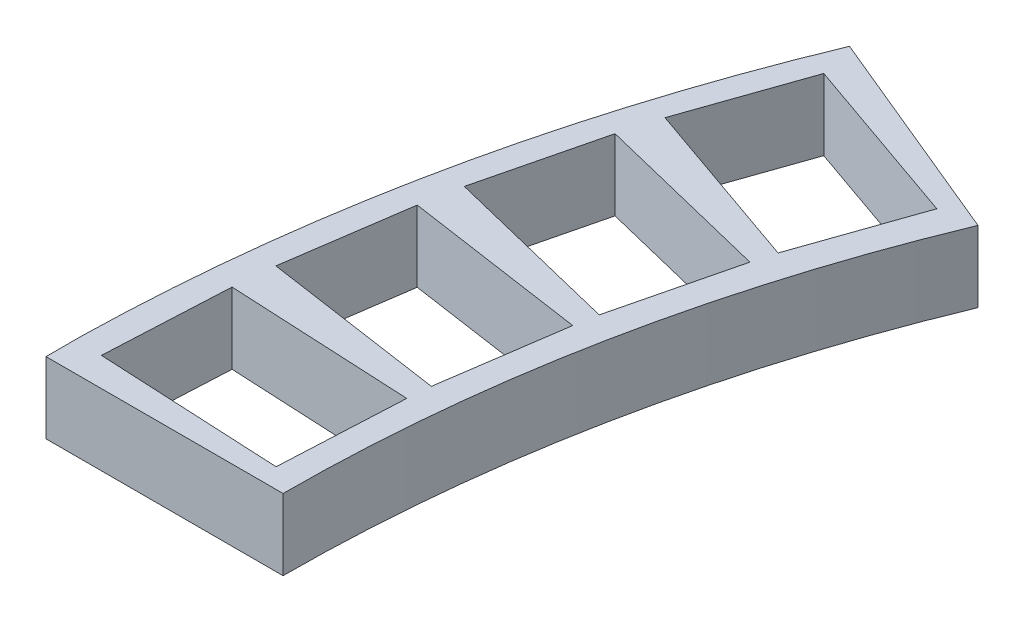
ISO-10303-21;
HEADER;
FILE_DESCRIPTION(('STEP AP214'),'2;1');
FILE_NAME('part.step','',(''),(''),'','','');
FILE_SCHEMA(('AUTOMOTIVE_DESIGN { 1 0 10303 214 1 1 1 1 }'));
ENDSEC;
DATA;
#1=APPLICATION_CONTEXT('core data for automotive mechanical design processes');
#2=APPLICATION_PROTOCOL_DEFINITION('international standard','automotive_design',2000,#1);
#3=PRODUCT_CONTEXT('',#1,'mechanical');
#4=PRODUCT('Part','Part','',(#3));
#5=PRODUCT_RELATED_PRODUCT_CATEGORY('part','',(#4));
#6=PRODUCT_DEFINITION_FORMATION('','',#4);
#7=PRODUCT_DEFINITION_CONTEXT('part definition',#1,'design');
#8=PRODUCT_DEFINITION('design','',#6,#7);
#9=PRODUCT_DEFINITION_SHAPE('','',#8);
#10=(LENGTH_UNIT() NAMED_UNIT(*) SI_UNIT(.MILLI.,.METRE.));
#11=(NAMED_UNIT(*) PLANE_ANGLE_UNIT() SI_UNIT($,.RADIAN.));
#12=(NAMED_UNIT(*) SI_UNIT($,.STERADIAN.) SOLID_ANGLE_UNIT());
#13=UNCERTAINTY_MEASURE_WITH_UNIT(LENGTH_MEASURE(1.E-05),#10,'distance_accuracy_value','');
#14=(GEOMETRIC_REPRESENTATION_CONTEXT(3) GLOBAL_UNCERTAINTY_ASSIGNED_CONTEXT((#13)) GLOBAL_UNIT_ASSIGNED_CONTEXT((#10,
#11,#12)) REPRESENTATION_CONTEXT('',''));
#15=CARTESIAN_POINT('',(0.,0.,0.));
#16=DIRECTION('',(0.,0.,1.));
#17=DIRECTION('',(1.,0.,0.));
#18=AXIS2_PLACEMENT_3D('',#15,#16,#17);
#19=CARTESIAN_POINT('',(0.,12.,0.));
#20=DIRECTION('',(0.,-1.,0.));
#21=DIRECTION('',(0.,0.,-1.));
#22=AXIS2_PLACEMENT_3D('',#19,#20,#21);
#23=PLANE('',#22);
#24=DIRECTION('',(0.998775470850136,0.,0.0494728089771555));
#25=VECTOR('',#24,1.);
#26=CARTESIAN_POINT('',(-259.677683337546,12.,-3.31462064663184));
#27=LINE('',#26,#25);
#28=CARTESIAN_POINT('',(-290.6397229339,12.,-4.84827772492366));
#29=VERTEX_POINT('',#28);
#30=CARTESIAN_POINT('',(-259.677683337546,12.,-3.31462064663184));
#31=VERTEX_POINT('',#30);
#32=EDGE_CURVE('E215',#29,#31,#27,.T.);
#33=ORIENTED_EDGE('',*,*,#32,.F.);
#34=DIRECTION('',(-0.0494728089771553,0.,0.998775470850135));
#35=VECTOR('',#34,1.);
#36=CARTESIAN_POINT('',(-290.6397229339,12.,-4.84827772492366));
#37=LINE('',#36,#35);
#38=CARTESIAN_POINT('',(-289.60079394538,12.,-25.8225626127765));
#39=VERTEX_POINT('',#38);
#40=EDGE_CURVE('E223',#39,#29,#37,.T.);
#41=ORIENTED_EDGE('',*,*,#40,.F.);
#42=DIRECTION('',(-0.998775470850136,0.,-0.0494728089771557));
#43=VECTOR('',#42,1.);
#44=CARTESIAN_POINT('',(-289.60079394538,12.,-25.8225626127765));
#45=LINE('',#44,#43);
#46=CARTESIAN_POINT('',(-258.638754349026,12.,-24.2889055344847));
#47=VERTEX_POINT('',#46);
#48=EDGE_CURVE('E220',#47,#39,#45,.T.);
#49=ORIENTED_EDGE('',*,*,#48,.F.);
#50=DIRECTION('',(0.0494728089771553,0.,-0.998775470850135));
#51=VECTOR('',#50,1.);
#52=CARTESIAN_POINT('',(-258.638754349026,12.,-24.2889055344847));
#53=LINE('',#52,#51);
#54=EDGE_CURVE('E217',#31,#47,#53,.T.);
#55=ORIENTED_EDGE('',*,*,#54,.F.);
#56=EDGE_LOOP('',(#33,#41,#49,#55));
#57=FACE_BOUND('',#56,.T.);
#58=DIRECTION('',(0.97123518890275,0.,0.238122253972701));
#59=VECTOR('',#58,1.);
#60=CARTESIAN_POINT('',(-254.615566778779,12.,-52.6883531890566));
#61=LINE('',#60,#59);
#62=CARTESIAN_POINT('',(-284.723857634765,12.,-60.0701430622103));
#63=VERTEX_POINT('',#62);
#64=CARTESIAN_POINT('',(-254.615566778779,12.,-52.6883531890566));
#65=VERTEX_POINT('',#64);
#66=EDGE_CURVE('E277',#63,#65,#61,.T.);
#67=ORIENTED_EDGE('',*,*,#66,.F.);
#68=DIRECTION('',(-0.238122253972697,0.,0.971235188902751));
#69=VECTOR('',#68,1.);
#70=CARTESIAN_POINT('',(-284.723857634765,12.,-60.0701430622103));
#71=LINE('',#70,#69);
#72=CARTESIAN_POINT('',(-279.723290301338,12.,-80.4660820291681));
#73=VERTEX_POINT('',#72);
#74=EDGE_CURVE('E285',#73,#63,#71,.T.);
#75=ORIENTED_EDGE('',*,*,#74,.F.);
#76=DIRECTION('',(-0.97123518890275,0.,-0.238122253972701));
#77=VECTOR('',#76,1.);
#78=CARTESIAN_POINT('',(-279.723290301338,12.,-80.4660820291681));
#79=LINE('',#78,#77);
#80=CARTESIAN_POINT('',(-249.614999445353,12.,-73.0842921560143));
#81=VERTEX_POINT('',#80);
#82=EDGE_CURVE('E282',#81,#73,#79,.T.);
#83=ORIENTED_EDGE('',*,*,#82,.F.);
#84=DIRECTION('',(0.238122253972699,0.,-0.971235188902751));
#85=VECTOR('',#84,1.);
#86=CARTESIAN_POINT('',(-249.614999445353,12.,-73.0842921560143));
#87=LINE('',#86,#85);
#88=EDGE_CURVE('E279',#65,#81,#87,.T.);
#89=ORIENTED_EDGE('',*,*,#88,.F.);
#90=EDGE_LOOP('',(#67,#75,#83,#89));
#91=FACE_BOUND('',#90,.T.);
#92=CARTESIAN_POINT('',(0.,12.,0.));
#93=DIRECTION('',(0.,1.,0.));
#94=DIRECTION('',(0.,0.,-1.));
#95=AXIS2_PLACEMENT_3D('',#92,#93,#94);
#96=CIRCLE('',#95,295.189854561563);
#97=CARTESIAN_POINT('',(-272.719864834412,12.,-112.964266742971));
#98=VERTEX_POINT('',#97);
#99=CARTESIAN_POINT('',(-295.127762341236,12.,-6.0542655650463));
#100=VERTEX_POINT('',#99);
#101=EDGE_CURVE('E308',#98,#100,#96,.T.);
#102=ORIENTED_EDGE('',*,*,#101,.T.);
#103=DIRECTION('',(0.,0.,1.));
#104=VECTOR('',#103,1.);
#105=CARTESIAN_POINT('',(-295.127762341236,12.,-6.0542655650463));
#106=LINE('',#105,#104);
#107=CARTESIAN_POINT('',(-295.127762341235,12.,-3.79080447587832E-12));
#108=VERTEX_POINT('',#107);
#109=EDGE_CURVE('E311',#100,#108,#106,.T.);
#110=ORIENTED_EDGE('',*,*,#109,.T.);
#111=DIRECTION('',(1.,0.,0.));
#112=VECTOR('',#111,1.);
#113=CARTESIAN_POINT('',(-295.127762341235,12.,-3.79080447587832E-12));
#114=LINE('',#113,#112);
#115=CARTESIAN_POINT('',(-255.189832201051,12.,0.));
#116=VERTEX_POINT('',#115);
#117=EDGE_CURVE('E314',#108,#116,#114,.T.);
#118=ORIENTED_EDGE('',*,*,#117,.T.);
#119=CARTESIAN_POINT('',(0.,12.,0.));
#120=DIRECTION('',(0.,-1.,0.));
#121=DIRECTION('',(0.,0.,1.));
#122=AXIS2_PLACEMENT_3D('',#119,#120,#121);
#123=CIRCLE('',#122,255.189832201051);
#124=CARTESIAN_POINT('',(-235.764662875541,12.,-97.6569208913699));
#125=VERTEX_POINT('',#124);
#126=EDGE_CURVE('E316',#116,#125,#123,.T.);
#127=ORIENTED_EDGE('',*,*,#126,.T.);
#128=DIRECTION('',(-0.923879532511287,0.,-0.38268343236509));
#129=VECTOR('',#128,1.);
#130=CARTESIAN_POINT('',(-272.719864834412,12.,-112.964266742971));
#131=LINE('',#130,#129);
#132=EDGE_CURVE('E318',#125,#98,#131,.T.);
#133=ORIENTED_EDGE('',*,*,#132,.T.);
#134=EDGE_LOOP('',(#102,#110,#118,#127,#133));
#135=FACE_BOUND('',#134,.T.);
#136=DIRECTION('',(0.989511320379551,0.,0.144455345490287));
#137=VECTOR('',#136,1.);
#138=CARTESIAN_POINT('',(-258.325942442025,12.,-28.1223982151977));
#139=LINE('',#138,#137);
#140=CARTESIAN_POINT('',(-289.000793373791,12.,-32.6005139253966));
#141=VERTEX_POINT('',#140);
#142=CARTESIAN_POINT('',(-258.325942442025,12.,-28.1223982151977));
#143=VERTEX_POINT('',#142);
#144=EDGE_CURVE('E246',#141,#143,#139,.T.);
#145=ORIENTED_EDGE('',*,*,#144,.F.);
#146=DIRECTION('',(-0.144455345490286,0.,0.989511320379551));
#147=VECTOR('',#146,1.);
#148=CARTESIAN_POINT('',(-289.000793373791,12.,-32.6005139253966));
#149=LINE('',#148,#147);
#150=CARTESIAN_POINT('',(-285.967231118495,12.,-53.3802516533672));
#151=VERTEX_POINT('',#150);
#152=EDGE_CURVE('E254',#151,#141,#149,.T.);
#153=ORIENTED_EDGE('',*,*,#152,.F.);
#154=DIRECTION('',(-0.989511320379551,0.,-0.144455345490288));
#155=VECTOR('',#154,1.);
#156=CARTESIAN_POINT('',(-285.967231118495,12.,-53.3802516533672));
#157=LINE('',#156,#155);
#158=CARTESIAN_POINT('',(-255.292380186729,12.,-48.9021359431683));
#159=VERTEX_POINT('',#158);
#160=EDGE_CURVE('E251',#159,#151,#157,.T.);
#161=ORIENTED_EDGE('',*,*,#160,.F.);
#162=DIRECTION('',(0.144455345490286,0.,-0.989511320379551));
#163=VECTOR('',#162,1.);
#164=CARTESIAN_POINT('',(-255.292380186729,12.,-48.9021359431683));
#165=LINE('',#164,#163);
#166=EDGE_CURVE('E248',#143,#159,#165,.T.);
#167=ORIENTED_EDGE('',*,*,#166,.F.);
#168=EDGE_LOOP('',(#145,#153,#161,#167));
#169=FACE_BOUND('',#168,.T.);
#170=DIRECTION('',(0.944113526410091,0.,0.329620462425351));
#171=VECTOR('',#170,1.);
#172=CARTESIAN_POINT('',(-248.580348619121,12.,-76.7887509680434));
#173=LINE('',#172,#171);
#174=CARTESIAN_POINT('',(-277.847867937834,12.,-87.0069853032293));
#175=VERTEX_POINT('',#174);
#176=CARTESIAN_POINT('',(-248.580348619121,12.,-76.7887509680434));
#177=VERTEX_POINT('',#176);
#178=EDGE_CURVE('E179',#175,#177,#173,.T.);
#179=ORIENTED_EDGE('',*,*,#178,.F.);
#180=DIRECTION('',(-0.329620462425351,0.,0.944113526410091));
#181=VECTOR('',#180,1.);
#182=CARTESIAN_POINT('',(-277.847867937834,12.,-87.0069853032293));
#183=LINE('',#182,#181);
#184=CARTESIAN_POINT('',(-270.925838226901,12.,-106.833369357841));
#185=VERTEX_POINT('',#184);
#186=EDGE_CURVE('E201',#185,#175,#183,.T.);
#187=ORIENTED_EDGE('',*,*,#186,.F.);
#188=DIRECTION('',(-0.944113526410091,0.,-0.329620462425351));
#189=VECTOR('',#188,1.);
#190=CARTESIAN_POINT('',(-270.925838226901,12.,-106.833369357841));
#191=LINE('',#190,#189);
#192=CARTESIAN_POINT('',(-241.658318908188,12.,-96.6151350226553));
#193=VERTEX_POINT('',#192);
#194=EDGE_CURVE('E199',#193,#185,#191,.T.);
#195=ORIENTED_EDGE('',*,*,#194,.F.);
#196=DIRECTION('',(0.329620462425351,0.,-0.944113526410091));
#197=VECTOR('',#196,1.);
#198=CARTESIAN_POINT('',(-241.658318908188,12.,-96.6151350226553));
#199=LINE('',#198,#197);
#200=EDGE_CURVE('E187',#177,#193,#199,.T.);
#201=ORIENTED_EDGE('',*,*,#200,.F.);
#202=EDGE_LOOP('',(#179,#187,#195,#201));
#203=FACE_BOUND('',#202,.T.);
#204=ADVANCED_FACE('F36',(#57,#91,#135,#169,#203),#23,.F.);
#205=CARTESIAN_POINT('',(0.,0.,0.));
#206=DIRECTION('',(0.,-1.,0.));
#207=DIRECTION('',(0.,0.,-1.));
#208=AXIS2_PLACEMENT_3D('',#205,#206,#207);
#209=PLANE('',#208);
#210=CARTESIAN_POINT('',(0.,0.,0.));
#211=DIRECTION('',(0.,1.,0.));
#212=DIRECTION('',(0.,0.,-1.));
#213=AXIS2_PLACEMENT_3D('',#210,#211,#212);
#214=CIRCLE('',#213,295.189854561563);
#215=CARTESIAN_POINT('',(-272.719864834412,0.,-112.964266742971));
#216=VERTEX_POINT('',#215);
#217=CARTESIAN_POINT('',(-295.127762341236,0.,-6.0542655650463));
#218=VERTEX_POINT('',#217);
#219=EDGE_CURVE('E307',#216,#218,#214,.T.);
#220=ORIENTED_EDGE('',*,*,#219,.F.);
#221=DIRECTION('',(-0.923879532511287,0.,-0.38268343236509));
#222=VECTOR('',#221,1.);
#223=CARTESIAN_POINT('',(-272.719864834412,0.,-112.964266742971));
#224=LINE('',#223,#222);
#225=CARTESIAN_POINT('',(-235.764662875541,0.,-97.6569208913699));
#226=VERTEX_POINT('',#225);
#227=EDGE_CURVE('E312',#226,#216,#224,.T.);
#228=ORIENTED_EDGE('',*,*,#227,.F.);
#229=CARTESIAN_POINT('',(0.,0.,0.));
#230=DIRECTION('',(0.,-1.,0.));
#231=DIRECTION('',(0.,0.,1.));
#232=AXIS2_PLACEMENT_3D('',#229,#230,#231);
#233=CIRCLE('',#232,255.189832201051);
#234=CARTESIAN_POINT('',(-255.189832201051,0.,0.));
#235=VERTEX_POINT('',#234);
#236=EDGE_CURVE('E327',#235,#226,#233,.T.);
#237=ORIENTED_EDGE('',*,*,#236,.F.);
#238=DIRECTION('',(1.,0.,0.));
#239=VECTOR('',#238,1.);
#240=CARTESIAN_POINT('',(-295.127762341235,0.,-3.79080447587832E-12));
#241=LINE('',#240,#239);
#242=CARTESIAN_POINT('',(-295.127762341235,0.,-3.79080447587832E-12));
#243=VERTEX_POINT('',#242);
#244=EDGE_CURVE('E325',#243,#235,#241,.T.);
#245=ORIENTED_EDGE('',*,*,#244,.F.);
#246=DIRECTION('',(0.,0.,1.));
#247=VECTOR('',#246,1.);
#248=CARTESIAN_POINT('',(-295.127762341236,0.,-6.0542655650463));
#249=LINE('',#248,#247);
#250=EDGE_CURVE('E323',#218,#243,#249,.T.);
#251=ORIENTED_EDGE('',*,*,#250,.F.);
#252=EDGE_LOOP('',(#220,#228,#237,#245,#251));
#253=FACE_BOUND('',#252,.T.);
#254=DIRECTION('',(-0.238122253972697,0.,0.971235188902751));
#255=VECTOR('',#254,1.);
#256=CARTESIAN_POINT('',(-284.723857634765,0.,-60.0701430622103));
#257=LINE('',#256,#255);
#258=CARTESIAN_POINT('',(-279.723290301338,0.,-80.4660820291681));
#259=VERTEX_POINT('',#258);
#260=CARTESIAN_POINT('',(-284.723857634765,0.,-60.0701430622103));
#261=VERTEX_POINT('',#260);
#262=EDGE_CURVE('E280',#259,#261,#257,.T.);
#263=ORIENTED_EDGE('',*,*,#262,.T.);
#264=DIRECTION('',(0.97123518890275,0.,0.238122253972701));
#265=VECTOR('',#264,1.);
#266=CARTESIAN_POINT('',(-254.615566778779,0.,-52.6883531890566));
#267=LINE('',#266,#265);
#268=CARTESIAN_POINT('',(-254.615566778779,0.,-52.6883531890566));
#269=VERTEX_POINT('',#268);
#270=EDGE_CURVE('E276',#261,#269,#267,.T.);
#271=ORIENTED_EDGE('',*,*,#270,.T.);
#272=DIRECTION('',(0.238122253972699,0.,-0.971235188902751));
#273=VECTOR('',#272,1.);
#274=CARTESIAN_POINT('',(-249.614999445353,0.,-73.0842921560143));
#275=LINE('',#274,#273);
#276=CARTESIAN_POINT('',(-249.614999445353,0.,-73.0842921560143));
#277=VERTEX_POINT('',#276);
#278=EDGE_CURVE('E290',#269,#277,#275,.T.);
#279=ORIENTED_EDGE('',*,*,#278,.T.);
#280=DIRECTION('',(-0.97123518890275,0.,-0.238122253972701));
#281=VECTOR('',#280,1.);
#282=CARTESIAN_POINT('',(-279.723290301338,0.,-80.4660820291681));
#283=LINE('',#282,#281);
#284=EDGE_CURVE('E293',#277,#259,#283,.T.);
#285=ORIENTED_EDGE('',*,*,#284,.T.);
#286=EDGE_LOOP('',(#263,#271,#279,#285));
#287=FACE_BOUND('',#286,.T.);
#288=DIRECTION('',(-0.144455345490286,0.,0.989511320379551));
#289=VECTOR('',#288,1.);
#290=CARTESIAN_POINT('',(-289.000793373791,0.,-32.6005139253966));
#291=LINE('',#290,#289);
#292=CARTESIAN_POINT('',(-285.967231118495,0.,-53.3802516533672));
#293=VERTEX_POINT('',#292);
#294=CARTESIAN_POINT('',(-289.000793373791,0.,-32.6005139253966));
#295=VERTEX_POINT('',#294);
#296=EDGE_CURVE('E249',#293,#295,#291,.T.);
#297=ORIENTED_EDGE('',*,*,#296,.T.);
#298=DIRECTION('',(0.989511320379551,0.,0.144455345490287));
#299=VECTOR('',#298,1.);
#300=CARTESIAN_POINT('',(-258.325942442025,0.,-28.1223982151977));
#301=LINE('',#300,#299);
#302=CARTESIAN_POINT('',(-258.325942442025,0.,-28.1223982151977));
#303=VERTEX_POINT('',#302);
#304=EDGE_CURVE('E245',#295,#303,#301,.T.);
#305=ORIENTED_EDGE('',*,*,#304,.T.);
#306=DIRECTION('',(0.144455345490286,0.,-0.989511320379551));
#307=VECTOR('',#306,1.);
#308=CARTESIAN_POINT('',(-255.292380186729,0.,-48.9021359431683));
#309=LINE('',#308,#307);
#310=CARTESIAN_POINT('',(-255.292380186729,0.,-48.9021359431683));
#311=VERTEX_POINT('',#310);
#312=EDGE_CURVE('E259',#303,#311,#309,.T.);
#313=ORIENTED_EDGE('',*,*,#312,.T.);
#314=DIRECTION('',(-0.989511320379551,0.,-0.144455345490288));
#315=VECTOR('',#314,1.);
#316=CARTESIAN_POINT('',(-285.967231118495,0.,-53.3802516533672));
#317=LINE('',#316,#315);
#318=EDGE_CURVE('E262',#311,#293,#317,.T.);
#319=ORIENTED_EDGE('',*,*,#318,.T.);
#320=EDGE_LOOP('',(#297,#305,#313,#319));
#321=FACE_BOUND('',#320,.T.);
#322=DIRECTION('',(-0.0494728089771553,0.,0.998775470850135));
#323=VECTOR('',#322,1.);
#324=CARTESIAN_POINT('',(-290.6397229339,0.,-4.84827772492366));
#325=LINE('',#324,#323);
#326=CARTESIAN_POINT('',(-289.60079394538,0.,-25.8225626127765));
#327=VERTEX_POINT('',#326);
#328=CARTESIAN_POINT('',(-290.6397229339,0.,-4.84827772492366));
#329=VERTEX_POINT('',#328);
#330=EDGE_CURVE('E218',#327,#329,#325,.T.);
#331=ORIENTED_EDGE('',*,*,#330,.T.);
#332=DIRECTION('',(0.998775470850136,0.,0.0494728089771555));
#333=VECTOR('',#332,1.);
#334=CARTESIAN_POINT('',(-259.677683337546,0.,-3.31462064663184));
#335=LINE('',#334,#333);
#336=CARTESIAN_POINT('',(-259.677683337546,0.,-3.31462064663184));
#337=VERTEX_POINT('',#336);
#338=EDGE_CURVE('E195',#329,#337,#335,.T.);
#339=ORIENTED_EDGE('',*,*,#338,.T.);
#340=DIRECTION('',(0.0494728089771553,0.,-0.998775470850135));
#341=VECTOR('',#340,1.);
#342=CARTESIAN_POINT('',(-258.638754349026,0.,-24.2889055344847));
#343=LINE('',#342,#341);
#344=CARTESIAN_POINT('',(-258.638754349026,0.,-24.2889055344847));
#345=VERTEX_POINT('',#344);
#346=EDGE_CURVE('E228',#337,#345,#343,.T.);
#347=ORIENTED_EDGE('',*,*,#346,.T.);
#348=DIRECTION('',(-0.998775470850136,0.,-0.0494728089771557));
#349=VECTOR('',#348,1.);
#350=CARTESIAN_POINT('',(-289.60079394538,0.,-25.8225626127765));
#351=LINE('',#350,#349);
#352=EDGE_CURVE('E231',#345,#327,#351,.T.);
#353=ORIENTED_EDGE('',*,*,#352,.T.);
#354=EDGE_LOOP('',(#331,#339,#347,#353));
#355=FACE_BOUND('',#354,.T.);
#356=DIRECTION('',(-0.329620462425351,0.,0.944113526410091));
#357=VECTOR('',#356,1.);
#358=CARTESIAN_POINT('',(-277.847867937834,0.,-87.0069853032293));
#359=LINE('',#358,#357);
#360=CARTESIAN_POINT('',(-270.925838226901,0.,-106.833369357841));
#361=VERTEX_POINT('',#360);
#362=CARTESIAN_POINT('',(-277.847867937834,0.,-87.0069853032293));
#363=VERTEX_POINT('',#362);
#364=EDGE_CURVE('E188',#361,#363,#359,.T.);
#365=ORIENTED_EDGE('',*,*,#364,.T.);
#366=DIRECTION('',(0.944113526410091,0.,0.329620462425351));
#367=VECTOR('',#366,1.);
#368=CARTESIAN_POINT('',(-248.580348619121,0.,-76.7887509680434));
#369=LINE('',#368,#367);
#370=CARTESIAN_POINT('',(-248.580348619121,0.,-76.7887509680434));
#371=VERTEX_POINT('',#370);
#372=EDGE_CURVE('E59',#363,#371,#369,.T.);
#373=ORIENTED_EDGE('',*,*,#372,.T.);
#374=DIRECTION('',(0.329620462425351,0.,-0.944113526410091));
#375=VECTOR('',#374,1.);
#376=CARTESIAN_POINT('',(-241.658318908188,0.,-96.6151350226553));
#377=LINE('',#376,#375);
#378=CARTESIAN_POINT('',(-241.658318908188,0.,-96.6151350226553));
#379=VERTEX_POINT('',#378);
#380=EDGE_CURVE('E194',#371,#379,#377,.T.);
#381=ORIENTED_EDGE('',*,*,#380,.T.);
#382=DIRECTION('',(-0.944113526410091,0.,-0.329620462425351));
#383=VECTOR('',#382,1.);
#384=CARTESIAN_POINT('',(-270.925838226901,0.,-106.833369357841));
#385=LINE('',#384,#383);
#386=EDGE_CURVE('E207',#379,#361,#385,.T.);
#387=ORIENTED_EDGE('',*,*,#386,.T.);
#388=EDGE_LOOP('',(#365,#373,#381,#387));
#389=FACE_BOUND('',#388,.T.);
#390=ADVANCED_FACE('F348',(#253,#287,#321,#355,#389),#209,.T.);
#391=CARTESIAN_POINT('',(0.,12.,0.));
#392=DIRECTION('',(0.,-1.,0.));
#393=DIRECTION('',(0.,0.,-1.));
#394=AXIS2_PLACEMENT_3D('',#391,#392,#393);
#395=CYLINDRICAL_SURFACE('',#394,295.189854561563);
#396=ORIENTED_EDGE('',*,*,#219,.T.);
#397=DIRECTION('',(0.,-1.,0.));
#398=VECTOR('',#397,1.);
#399=CARTESIAN_POINT('',(-295.127762341236,12.,-6.0542655650463));
#400=LINE('',#399,#398);
#401=EDGE_CURVE('E11',#100,#218,#400,.T.);
#402=ORIENTED_EDGE('',*,*,#401,.F.);
#403=ORIENTED_EDGE('',*,*,#101,.F.);
#404=DIRECTION('',(0.,-1.,0.));
#405=VECTOR('',#404,1.);
#406=CARTESIAN_POINT('',(-272.719864834412,12.,-112.964266742971));
#407=LINE('',#406,#405);
#408=EDGE_CURVE('E320',#98,#216,#407,.T.);
#409=ORIENTED_EDGE('',*,*,#408,.T.);
#410=EDGE_LOOP('',(#396,#402,#403,#409));
#411=FACE_BOUND('',#410,.T.);
#412=ADVANCED_FACE('F38',(#411),#395,.T.);
#413=CARTESIAN_POINT('',(-295.127762341236,12.,-6.0542655650463));
#414=DIRECTION('',(1.,0.,0.));
#415=DIRECTION('',(0.,0.,-1.));
#416=AXIS2_PLACEMENT_3D('',#413,#414,#415);
#417=PLANE('',#416);
#418=ORIENTED_EDGE('',*,*,#250,.T.);
#419=DIRECTION('',(0.,-1.,0.));
#420=VECTOR('',#419,1.);
#421=CARTESIAN_POINT('',(-295.127762341235,12.,-3.79080447587832E-12));
#422=LINE('',#421,#420);
#423=EDGE_CURVE('E44',#108,#243,#422,.T.);
#424=ORIENTED_EDGE('',*,*,#423,.F.);
#425=ORIENTED_EDGE('',*,*,#109,.F.);
#426=ORIENTED_EDGE('',*,*,#401,.T.);
#427=EDGE_LOOP('',(#418,#424,#425,#426));
#428=FACE_BOUND('',#427,.T.);
#429=ADVANCED_FACE('F363',(#428),#417,.F.);
#430=CARTESIAN_POINT('',(-295.127762341235,12.,-3.79080447587832E-12));
#431=DIRECTION('',(0.,0.,-1.));
#432=DIRECTION('',(-1.,0.,0.));
#433=AXIS2_PLACEMENT_3D('',#430,#431,#432);
#434=PLANE('',#433);
#435=ORIENTED_EDGE('',*,*,#244,.T.);
#436=DIRECTION('',(0.,-1.,0.));
#437=VECTOR('',#436,1.);
#438=CARTESIAN_POINT('',(-255.189832201051,12.,0.));
#439=LINE('',#438,#437);
#440=EDGE_CURVE('E335',#116,#235,#439,.T.);
#441=ORIENTED_EDGE('',*,*,#440,.F.);
#442=ORIENTED_EDGE('',*,*,#117,.F.);
#443=ORIENTED_EDGE('',*,*,#423,.T.);
#444=EDGE_LOOP('',(#435,#441,#442,#443));
#445=FACE_BOUND('',#444,.T.);
#446=ADVANCED_FACE('F342',(#445),#434,.F.);
#447=CARTESIAN_POINT('',(0.,12.,0.));
#448=DIRECTION('',(0.,-1.,0.));
#449=DIRECTION('',(0.,0.,-1.));
#450=AXIS2_PLACEMENT_3D('',#447,#448,#449);
#451=CYLINDRICAL_SURFACE('',#450,255.189832201051);
#452=ORIENTED_EDGE('',*,*,#236,.T.);
#453=DIRECTION('',(0.,-1.,0.));
#454=VECTOR('',#453,1.);
#455=CARTESIAN_POINT('',(-235.764662875541,12.,-97.6569208913699));
#456=LINE('',#455,#454);
#457=EDGE_CURVE('E332',#125,#226,#456,.T.);
#458=ORIENTED_EDGE('',*,*,#457,.F.);
#459=ORIENTED_EDGE('',*,*,#126,.F.);
#460=ORIENTED_EDGE('',*,*,#440,.T.);
#461=EDGE_LOOP('',(#452,#458,#459,#460));
#462=FACE_BOUND('',#461,.T.);
#463=ADVANCED_FACE('F353',(#462),#451,.F.);
#464=CARTESIAN_POINT('',(-272.719864834412,12.,-112.964266742971));
#465=DIRECTION('',(-0.38268343236509,0.,0.923879532511287));
#466=DIRECTION('',(0.923879532511287,0.,0.38268343236509));
#467=AXIS2_PLACEMENT_3D('',#464,#465,#466);
#468=PLANE('',#467);
#469=ORIENTED_EDGE('',*,*,#227,.T.);
#470=ORIENTED_EDGE('',*,*,#408,.F.);
#471=ORIENTED_EDGE('',*,*,#132,.F.);
#472=ORIENTED_EDGE('',*,*,#457,.T.);
#473=EDGE_LOOP('',(#469,#470,#471,#472));
#474=FACE_BOUND('',#473,.T.);
#475=ADVANCED_FACE('F357',(#474),#468,.F.);
#476=CARTESIAN_POINT('',(-254.615566778779,12.,-52.6883531890566));
#477=DIRECTION('',(0.238122253972701,0.,-0.97123518890275));
#478=DIRECTION('',(-0.97123518890275,0.,-0.238122253972701));
#479=AXIS2_PLACEMENT_3D('',#476,#477,#478);
#480=PLANE('',#479);
#481=ORIENTED_EDGE('',*,*,#270,.F.);
#482=DIRECTION('',(0.,-1.,0.));
#483=VECTOR('',#482,1.);
#484=CARTESIAN_POINT('',(-284.723857634765,12.,-60.0701430622103));
#485=LINE('',#484,#483);
#486=EDGE_CURVE('E287',#63,#261,#485,.T.);
#487=ORIENTED_EDGE('',*,*,#486,.F.);
#488=ORIENTED_EDGE('',*,*,#66,.T.);
#489=DIRECTION('',(0.,-1.,0.));
#490=VECTOR('',#489,1.);
#491=CARTESIAN_POINT('',(-254.615566778779,12.,-52.6883531890566));
#492=LINE('',#491,#490);
#493=EDGE_CURVE('E304',#65,#269,#492,.T.);
#494=ORIENTED_EDGE('',*,*,#493,.T.);
#495=EDGE_LOOP('',(#481,#487,#488,#494));
#496=FACE_BOUND('',#495,.T.);
#497=ADVANCED_FACE('F379',(#496),#480,.T.);
#498=CARTESIAN_POINT('',(-249.614999445353,12.,-73.0842921560143));
#499=DIRECTION('',(-0.971235188902751,0.,-0.238122253972698));
#500=DIRECTION('',(-0.238122253972699,0.,0.971235188902751));
#501=AXIS2_PLACEMENT_3D('',#498,#499,#500);
#502=PLANE('',#501);
#503=ORIENTED_EDGE('',*,*,#278,.F.);
#504=ORIENTED_EDGE('',*,*,#493,.F.);
#505=ORIENTED_EDGE('',*,*,#88,.T.);
#506=DIRECTION('',(0.,-1.,0.));
#507=VECTOR('',#506,1.);
#508=CARTESIAN_POINT('',(-249.614999445353,12.,-73.0842921560143));
#509=LINE('',#508,#507);
#510=EDGE_CURVE('E302',#81,#277,#509,.T.);
#511=ORIENTED_EDGE('',*,*,#510,.T.);
#512=EDGE_LOOP('',(#503,#504,#505,#511));
#513=FACE_BOUND('',#512,.T.);
#514=ADVANCED_FACE('F405',(#513),#502,.T.);
#515=CARTESIAN_POINT('',(-279.723290301338,12.,-80.4660820291681));
#516=DIRECTION('',(-0.238122253972701,0.,0.97123518890275));
#517=DIRECTION('',(0.97123518890275,0.,0.238122253972701));
#518=AXIS2_PLACEMENT_3D('',#515,#516,#517);
#519=PLANE('',#518);
#520=ORIENTED_EDGE('',*,*,#284,.F.);
#521=ORIENTED_EDGE('',*,*,#510,.F.);
#522=ORIENTED_EDGE('',*,*,#82,.T.);
#523=DIRECTION('',(0.,-1.,0.));
#524=VECTOR('',#523,1.);
#525=CARTESIAN_POINT('',(-279.723290301338,12.,-80.4660820291681));
#526=LINE('',#525,#524);
#527=EDGE_CURVE('E300',#73,#259,#526,.T.);
#528=ORIENTED_EDGE('',*,*,#527,.T.);
#529=EDGE_LOOP('',(#520,#521,#522,#528));
#530=FACE_BOUND('',#529,.T.);
#531=ADVANCED_FACE('F412',(#530),#519,.T.);
#532=CARTESIAN_POINT('',(-284.723857634765,12.,-60.0701430622103));
#533=DIRECTION('',(0.971235188902751,0.,0.238122253972697));
#534=DIRECTION('',(0.238122253972697,0.,-0.971235188902751));
#535=AXIS2_PLACEMENT_3D('',#532,#533,#534);
#536=PLANE('',#535);
#537=ORIENTED_EDGE('',*,*,#262,.F.);
#538=ORIENTED_EDGE('',*,*,#527,.F.);
#539=ORIENTED_EDGE('',*,*,#74,.T.);
#540=ORIENTED_EDGE('',*,*,#486,.T.);
#541=EDGE_LOOP('',(#537,#538,#539,#540));
#542=FACE_BOUND('',#541,.T.);
#543=ADVANCED_FACE('F419',(#542),#536,.T.);
#544=CARTESIAN_POINT('',(-258.325942442025,12.,-28.1223982151977));
#545=DIRECTION('',(0.144455345490287,0.,-0.989511320379551));
#546=DIRECTION('',(-0.989511320379551,0.,-0.144455345490287));
#547=AXIS2_PLACEMENT_3D('',#544,#545,#546);
#548=PLANE('',#547);
#549=ORIENTED_EDGE('',*,*,#304,.F.);
#550=DIRECTION('',(0.,-1.,0.));
#551=VECTOR('',#550,1.);
#552=CARTESIAN_POINT('',(-289.000793373791,12.,-32.6005139253966));
#553=LINE('',#552,#551);
#554=EDGE_CURVE('E256',#141,#295,#553,.T.);
#555=ORIENTED_EDGE('',*,*,#554,.F.);
#556=ORIENTED_EDGE('',*,*,#144,.T.);
#557=DIRECTION('',(0.,-1.,0.));
#558=VECTOR('',#557,1.);
#559=CARTESIAN_POINT('',(-258.325942442025,12.,-28.1223982151977));
#560=LINE('',#559,#558);
#561=EDGE_CURVE('E273',#143,#303,#560,.T.);
#562=ORIENTED_EDGE('',*,*,#561,.T.);
#563=EDGE_LOOP('',(#549,#555,#556,#562));
#564=FACE_BOUND('',#563,.T.);
#565=ADVANCED_FACE('F427',(#564),#548,.T.);
#566=CARTESIAN_POINT('',(-255.292380186729,12.,-48.9021359431683));
#567=DIRECTION('',(-0.989511320379551,0.,-0.144455345490286));
#568=DIRECTION('',(-0.144455345490286,0.,0.989511320379551));
#569=AXIS2_PLACEMENT_3D('',#566,#567,#568);
#570=PLANE('',#569);
#571=ORIENTED_EDGE('',*,*,#312,.F.);
#572=ORIENTED_EDGE('',*,*,#561,.F.);
#573=ORIENTED_EDGE('',*,*,#166,.T.);
#574=DIRECTION('',(0.,-1.,0.));
#575=VECTOR('',#574,1.);
#576=CARTESIAN_POINT('',(-255.292380186729,12.,-48.9021359431683));
#577=LINE('',#576,#575);
#578=EDGE_CURVE('E271',#159,#311,#577,.T.);
#579=ORIENTED_EDGE('',*,*,#578,.T.);
#580=EDGE_LOOP('',(#571,#572,#573,#579));
#581=FACE_BOUND('',#580,.T.);
#582=ADVANCED_FACE('F435',(#581),#570,.T.);
#583=CARTESIAN_POINT('',(-285.967231118495,12.,-53.3802516533672));
#584=DIRECTION('',(-0.144455345490288,0.,0.98951132037955));
#585=DIRECTION('',(0.989511320379551,0.,0.144455345490288));
#586=AXIS2_PLACEMENT_3D('',#583,#584,#585);
#587=PLANE('',#586);
#588=ORIENTED_EDGE('',*,*,#318,.F.);
#589=ORIENTED_EDGE('',*,*,#578,.F.);
#590=ORIENTED_EDGE('',*,*,#160,.T.);
#591=DIRECTION('',(0.,-1.,0.));
#592=VECTOR('',#591,1.);
#593=CARTESIAN_POINT('',(-285.967231118495,12.,-53.3802516533672));
#594=LINE('',#593,#592);
#595=EDGE_CURVE('E269',#151,#293,#594,.T.);
#596=ORIENTED_EDGE('',*,*,#595,.T.);
#597=EDGE_LOOP('',(#588,#589,#590,#596));
#598=FACE_BOUND('',#597,.T.);
#599=ADVANCED_FACE('F443',(#598),#587,.T.);
#600=CARTESIAN_POINT('',(-289.000793373791,12.,-32.6005139253966));
#601=DIRECTION('',(0.989511320379551,0.,0.144455345490286));
#602=DIRECTION('',(0.144455345490286,0.,-0.989511320379551));
#603=AXIS2_PLACEMENT_3D('',#600,#601,#602);
#604=PLANE('',#603);
#605=ORIENTED_EDGE('',*,*,#296,.F.);
#606=ORIENTED_EDGE('',*,*,#595,.F.);
#607=ORIENTED_EDGE('',*,*,#152,.T.);
#608=ORIENTED_EDGE('',*,*,#554,.T.);
#609=EDGE_LOOP('',(#605,#606,#607,#608));
#610=FACE_BOUND('',#609,.T.);
#611=ADVANCED_FACE('F451',(#610),#604,.T.);
#612=CARTESIAN_POINT('',(-259.677683337546,12.,-3.31462064663184));
#613=DIRECTION('',(0.0494728089771555,0.,-0.998775470850135));
#614=DIRECTION('',(-0.998775470850136,0.,-0.0494728089771555));
#615=AXIS2_PLACEMENT_3D('',#612,#613,#614);
#616=PLANE('',#615);
#617=ORIENTED_EDGE('',*,*,#338,.F.);
#618=DIRECTION('',(0.,-1.,0.));
#619=VECTOR('',#618,1.);
#620=CARTESIAN_POINT('',(-290.6397229339,12.,-4.84827772492366));
#621=LINE('',#620,#619);
#622=EDGE_CURVE('E225',#29,#329,#621,.T.);
#623=ORIENTED_EDGE('',*,*,#622,.F.);
#624=ORIENTED_EDGE('',*,*,#32,.T.);
#625=DIRECTION('',(0.,-1.,0.));
#626=VECTOR('',#625,1.);
#627=CARTESIAN_POINT('',(-259.677683337546,12.,-3.31462064663184));
#628=LINE('',#627,#626);
#629=EDGE_CURVE('E242',#31,#337,#628,.T.);
#630=ORIENTED_EDGE('',*,*,#629,.T.);
#631=EDGE_LOOP('',(#617,#623,#624,#630));
#632=FACE_BOUND('',#631,.T.);
#633=ADVANCED_FACE('F459',(#632),#616,.T.);
#634=CARTESIAN_POINT('',(-258.638754349026,12.,-24.2889055344847));
#635=DIRECTION('',(-0.998775470850136,0.,-0.0494728089771553));
#636=DIRECTION('',(-0.0494728089771553,0.,0.998775470850136));
#637=AXIS2_PLACEMENT_3D('',#634,#635,#636);
#638=PLANE('',#637);
#639=ORIENTED_EDGE('',*,*,#346,.F.);
#640=ORIENTED_EDGE('',*,*,#629,.F.);
#641=ORIENTED_EDGE('',*,*,#54,.T.);
#642=DIRECTION('',(0.,-1.,0.));
#643=VECTOR('',#642,1.);
#644=CARTESIAN_POINT('',(-258.638754349026,12.,-24.2889055344847));
#645=LINE('',#644,#643);
#646=EDGE_CURVE('E240',#47,#345,#645,.T.);
#647=ORIENTED_EDGE('',*,*,#646,.T.);
#648=EDGE_LOOP('',(#639,#640,#641,#647));
#649=FACE_BOUND('',#648,.T.);
#650=ADVANCED_FACE('F467',(#649),#638,.T.);
#651=CARTESIAN_POINT('',(-289.60079394538,12.,-25.8225626127765));
#652=DIRECTION('',(-0.0494728089771557,0.,0.998775470850135));
#653=DIRECTION('',(0.998775470850136,0.,0.0494728089771557));
#654=AXIS2_PLACEMENT_3D('',#651,#652,#653);
#655=PLANE('',#654);
#656=ORIENTED_EDGE('',*,*,#352,.F.);
#657=ORIENTED_EDGE('',*,*,#646,.F.);
#658=ORIENTED_EDGE('',*,*,#48,.T.);
#659=DIRECTION('',(0.,-1.,0.));
#660=VECTOR('',#659,1.);
#661=CARTESIAN_POINT('',(-289.60079394538,12.,-25.8225626127765));
#662=LINE('',#661,#660);
#663=EDGE_CURVE('E238',#39,#327,#662,.T.);
#664=ORIENTED_EDGE('',*,*,#663,.T.);
#665=EDGE_LOOP('',(#656,#657,#658,#664));
#666=FACE_BOUND('',#665,.T.);
#667=ADVANCED_FACE('F475',(#666),#655,.T.);
#668=CARTESIAN_POINT('',(-290.6397229339,12.,-4.84827772492366));
#669=DIRECTION('',(0.998775470850136,0.,0.0494728089771553));
#670=DIRECTION('',(0.0494728089771553,0.,-0.998775470850136));
#671=AXIS2_PLACEMENT_3D('',#668,#669,#670);
#672=PLANE('',#671);
#673=ORIENTED_EDGE('',*,*,#330,.F.);
#674=ORIENTED_EDGE('',*,*,#663,.F.);
#675=ORIENTED_EDGE('',*,*,#40,.T.);
#676=ORIENTED_EDGE('',*,*,#622,.T.);
#677=EDGE_LOOP('',(#673,#674,#675,#676));
#678=FACE_BOUND('',#677,.T.);
#679=ADVANCED_FACE('F483',(#678),#672,.T.);
#680=CARTESIAN_POINT('',(-248.580348619121,12.,-76.7887509680434));
#681=DIRECTION('',(0.329620462425351,0.,-0.944113526410091));
#682=DIRECTION('',(-0.944113526410091,0.,-0.329620462425351));
#683=AXIS2_PLACEMENT_3D('',#680,#681,#682);
#684=PLANE('',#683);
#685=ORIENTED_EDGE('',*,*,#372,.F.);
#686=DIRECTION('',(0.,-1.,0.));
#687=VECTOR('',#686,1.);
#688=CARTESIAN_POINT('',(-277.847867937834,12.,-87.0069853032293));
#689=LINE('',#688,#687);
#690=EDGE_CURVE('E183',#175,#363,#689,.T.);
#691=ORIENTED_EDGE('',*,*,#690,.F.);
#692=ORIENTED_EDGE('',*,*,#178,.T.);
#693=DIRECTION('',(0.,-1.,0.));
#694=VECTOR('',#693,1.);
#695=CARTESIAN_POINT('',(-248.580348619121,12.,-76.7887509680434));
#696=LINE('',#695,#694);
#697=EDGE_CURVE('E182',#177,#371,#696,.T.);
#698=ORIENTED_EDGE('',*,*,#697,.T.);
#699=EDGE_LOOP('',(#685,#691,#692,#698));
#700=FACE_BOUND('',#699,.T.);
#701=ADVANCED_FACE('F181',(#700),#684,.T.);
#702=CARTESIAN_POINT('',(-241.658318908188,12.,-96.6151350226553));
#703=DIRECTION('',(-0.944113526410091,0.,-0.329620462425351));
#704=DIRECTION('',(-0.329620462425351,0.,0.944113526410091));
#705=AXIS2_PLACEMENT_3D('',#702,#703,#704);
#706=PLANE('',#705);
#707=ORIENTED_EDGE('',*,*,#380,.F.);
#708=ORIENTED_EDGE('',*,*,#697,.F.);
#709=ORIENTED_EDGE('',*,*,#200,.T.);
#710=DIRECTION('',(0.,-1.,0.));
#711=VECTOR('',#710,1.);
#712=CARTESIAN_POINT('',(-241.658318908188,12.,-96.6151350226553));
#713=LINE('',#712,#711);
#714=EDGE_CURVE('E196',#193,#379,#713,.T.);
#715=ORIENTED_EDGE('',*,*,#714,.T.);
#716=EDGE_LOOP('',(#707,#708,#709,#715));
#717=FACE_BOUND('',#716,.T.);
#718=ADVANCED_FACE('F191',(#717),#706,.T.);
#719=CARTESIAN_POINT('',(-270.925838226901,12.,-106.833369357841));
#720=DIRECTION('',(-0.329620462425351,0.,0.944113526410091));
#721=DIRECTION('',(0.944113526410091,0.,0.329620462425351));
#722=AXIS2_PLACEMENT_3D('',#719,#720,#721);
#723=PLANE('',#722);
#724=ORIENTED_EDGE('',*,*,#386,.F.);
#725=ORIENTED_EDGE('',*,*,#714,.F.);
#726=ORIENTED_EDGE('',*,*,#194,.T.);
#727=DIRECTION('',(0.,-1.,0.));
#728=VECTOR('',#727,1.);
#729=CARTESIAN_POINT('',(-270.925838226901,12.,-106.833369357841));
#730=LINE('',#729,#728);
#731=EDGE_CURVE('E51',#185,#361,#730,.T.);
#732=ORIENTED_EDGE('',*,*,#731,.T.);
#733=EDGE_LOOP('',(#724,#725,#726,#732));
#734=FACE_BOUND('',#733,.T.);
#735=ADVANCED_FACE('F504',(#734),#723,.T.);
#736=CARTESIAN_POINT('',(-277.847867937834,12.,-87.0069853032293));
#737=DIRECTION('',(0.944113526410091,0.,0.329620462425351));
#738=DIRECTION('',(0.329620462425351,0.,-0.944113526410091));
#739=AXIS2_PLACEMENT_3D('',#736,#737,#738);
#740=PLANE('',#739);
#741=ORIENTED_EDGE('',*,*,#364,.F.);
#742=ORIENTED_EDGE('',*,*,#731,.F.);
#743=ORIENTED_EDGE('',*,*,#186,.T.);
#744=ORIENTED_EDGE('',*,*,#690,.T.);
#745=EDGE_LOOP('',(#741,#742,#743,#744));
#746=FACE_BOUND('',#745,.T.);
#747=ADVANCED_FACE('F511',(#746),#740,.T.);
#748=CLOSED_SHELL('',(#204,#390,#412,#429,#446,#463,#475,#497,#514,#531,#543,#565,#582,#599,
#611,#633,#650,#667,#679,#701,#718,#735,#747));
#749=MANIFOLD_SOLID_BREP('B2',#748);
#750=ADVANCED_BREP_SHAPE_REPRESENTATION('',(#18,#749),#14);
#751=SHAPE_DEFINITION_REPRESENTATION(#9,#750);
ENDSEC;
END-ISO-10303-21;
